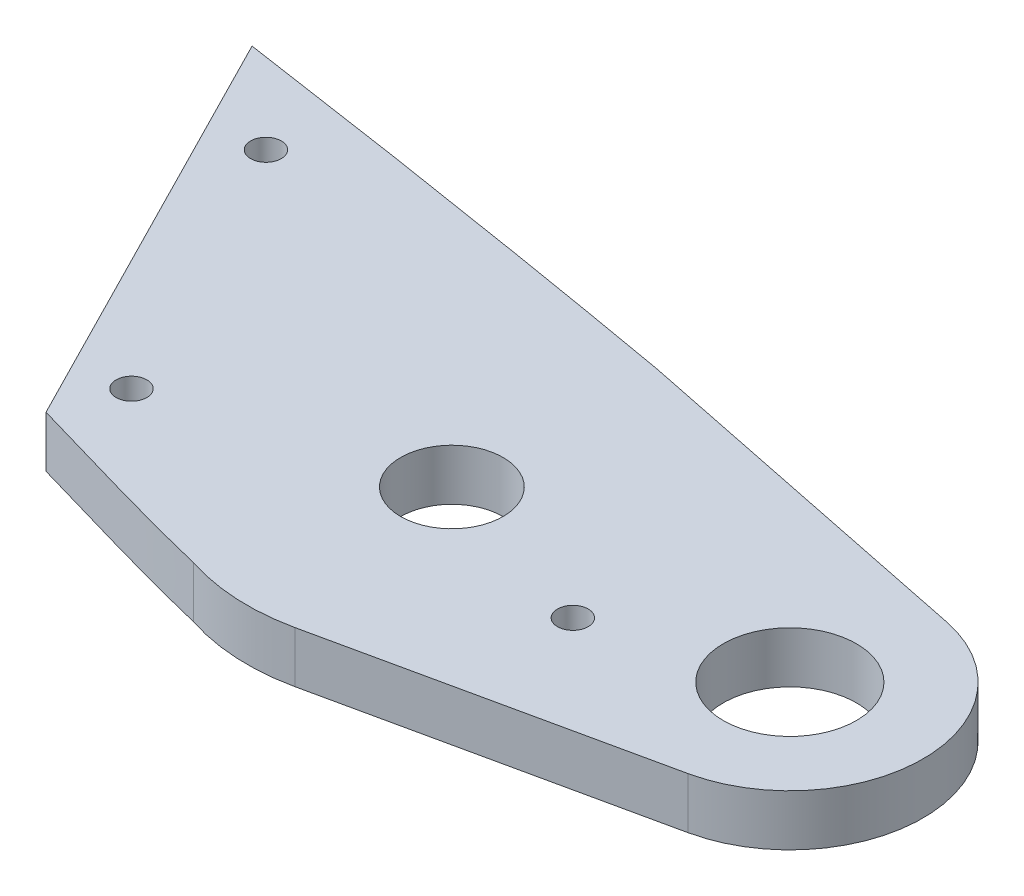
ISO-10303-21;
HEADER;
FILE_DESCRIPTION(('STEP AP214'),'2;1');
FILE_NAME('part.step','',(''),(''),'','','');
FILE_SCHEMA(('AUTOMOTIVE_DESIGN { 1 0 10303 214 1 1 1 1 }'));
ENDSEC;
DATA;
#1=APPLICATION_CONTEXT('core data for automotive mechanical design processes');
#2=APPLICATION_PROTOCOL_DEFINITION('international standard','automotive_design',2000,#1);
#3=PRODUCT_CONTEXT('',#1,'mechanical');
#4=PRODUCT('Part','Part','',(#3));
#5=PRODUCT_RELATED_PRODUCT_CATEGORY('part','',(#4));
#6=PRODUCT_DEFINITION_FORMATION('','',#4);
#7=PRODUCT_DEFINITION_CONTEXT('part definition',#1,'design');
#8=PRODUCT_DEFINITION('design','',#6,#7);
#9=PRODUCT_DEFINITION_SHAPE('','',#8);
#10=(LENGTH_UNIT() NAMED_UNIT(*) SI_UNIT(.MILLI.,.METRE.));
#11=(NAMED_UNIT(*) PLANE_ANGLE_UNIT() SI_UNIT($,.RADIAN.));
#12=(NAMED_UNIT(*) SI_UNIT($,.STERADIAN.) SOLID_ANGLE_UNIT());
#13=UNCERTAINTY_MEASURE_WITH_UNIT(LENGTH_MEASURE(1.E-05),#10,'distance_accuracy_value','');
#14=(GEOMETRIC_REPRESENTATION_CONTEXT(3) GLOBAL_UNCERTAINTY_ASSIGNED_CONTEXT((#13)) GLOBAL_UNIT_ASSIGNED_CONTEXT((#10,
#11,#12)) REPRESENTATION_CONTEXT('',''));
#15=CARTESIAN_POINT('',(0.,0.,0.));
#16=DIRECTION('',(0.,0.,1.));
#17=DIRECTION('',(1.,0.,0.));
#18=AXIS2_PLACEMENT_3D('',#15,#16,#17);
#19=CARTESIAN_POINT('',(4.24242424242424,-20.,19.5448672686026));
#20=DIRECTION('',(0.212121212121212,0.,0.977243363430127));
#21=DIRECTION('',(0.977243363430127,0.,-0.212121212121212));
#22=AXIS2_PLACEMENT_3D('',#19,#20,#21);
#23=PLANE('',#22);
#24=DIRECTION('',(0.,1.,0.));
#25=VECTOR('',#24,1.);
#26=CARTESIAN_POINT('',(35.7575757575758,-20.,12.7041637245917));
#27=LINE('',#26,#25);
#28=CARTESIAN_POINT('',(35.7575757575758,-20.,12.7041637245917));
#29=VERTEX_POINT('',#28);
#30=CARTESIAN_POINT('',(35.7575757575758,-15.,12.7041637245917));
#31=VERTEX_POINT('',#30);
#32=EDGE_CURVE('E314',#29,#31,#27,.T.);
#33=ORIENTED_EDGE('',*,*,#32,.T.);
#34=DIRECTION('',(-0.977243363430127,0.,0.212121212121212));
#35=VECTOR('',#34,1.);
#36=CARTESIAN_POINT('',(4.24242424242424,-15.,19.5448672686026));
#37=LINE('',#36,#35);
#38=CARTESIAN_POINT('',(4.24242424242424,-15.,19.5448672686026));
#39=VERTEX_POINT('',#38);
#40=EDGE_CURVE('E315',#31,#39,#37,.T.);
#41=ORIENTED_EDGE('',*,*,#40,.T.);
#42=DIRECTION('',(0.,1.,0.));
#43=VECTOR('',#42,1.);
#44=CARTESIAN_POINT('',(4.24242424242424,-20.,19.5448672686026));
#45=LINE('',#44,#43);
#46=CARTESIAN_POINT('',(4.24242424242424,-20.,19.5448672686026));
#47=VERTEX_POINT('',#46);
#48=EDGE_CURVE('E12',#47,#39,#45,.T.);
#49=ORIENTED_EDGE('',*,*,#48,.F.);
#50=DIRECTION('',(0.977243363430127,0.,-0.212121212121212));
#51=VECTOR('',#50,1.);
#52=CARTESIAN_POINT('',(4.24242424242424,-20.,19.5448672686026));
#53=LINE('',#52,#51);
#54=EDGE_CURVE('E316',#47,#29,#53,.T.);
#55=ORIENTED_EDGE('',*,*,#54,.T.);
#56=EDGE_LOOP('',(#33,#41,#49,#55));
#57=FACE_BOUND('',#56,.T.);
#58=ADVANCED_FACE('F183',(#57),#23,.T.);
#59=CARTESIAN_POINT('',(0.,-20.,0.));
#60=DIRECTION('',(0.,1.,0.));
#61=DIRECTION('',(0.,0.,1.));
#62=AXIS2_PLACEMENT_3D('',#59,#60,#61);
#63=CYLINDRICAL_SURFACE('',#62,20.);
#64=ORIENTED_EDGE('',*,*,#48,.T.);
#65=CARTESIAN_POINT('',(0.,-15.,0.));
#66=DIRECTION('',(0.,1.,0.));
#67=DIRECTION('',(0.,0.,1.));
#68=AXIS2_PLACEMENT_3D('',#65,#66,#67);
#69=CIRCLE('',#68,20.);
#70=CARTESIAN_POINT('',(-6.20287959444665,-15.,19.013791961016));
#71=VERTEX_POINT('',#70);
#72=EDGE_CURVE('E349',#39,#71,#69,.F.);
#73=ORIENTED_EDGE('',*,*,#72,.T.);
#74=DIRECTION('',(0.,1.,0.));
#75=VECTOR('',#74,1.);
#76=CARTESIAN_POINT('',(-6.20287959444665,-20.,19.013791961016));
#77=LINE('',#76,#75);
#78=CARTESIAN_POINT('',(-6.20287959444665,-20.,19.013791961016));
#79=VERTEX_POINT('',#78);
#80=EDGE_CURVE('E193',#79,#71,#77,.T.);
#81=ORIENTED_EDGE('',*,*,#80,.F.);
#82=CARTESIAN_POINT('',(0.,-20.,0.));
#83=DIRECTION('',(0.,1.,0.));
#84=DIRECTION('',(0.,0.,1.));
#85=AXIS2_PLACEMENT_3D('',#82,#83,#84);
#86=CIRCLE('',#85,20.);
#87=EDGE_CURVE('E264',#79,#47,#86,.T.);
#88=ORIENTED_EDGE('',*,*,#87,.T.);
#89=EDGE_LOOP('',(#64,#73,#81,#88));
#90=FACE_BOUND('',#89,.T.);
#91=ADVANCED_FACE('F288',(#90),#63,.T.);
#92=CARTESIAN_POINT('',(3.91711620015493,-20.,-19.2008804293113));
#93=DIRECTION('',(-0.199889916039891,0.,0.97981836146582));
#94=DIRECTION('',(0.97981836146582,0.,0.199889916039891));
#95=AXIS2_PLACEMENT_3D('',#92,#93,#94);
#96=PLANE('',#95);
#97=DIRECTION('',(-0.97981836146582,0.,-0.199889916039891));
#98=VECTOR('',#97,1.);
#99=CARTESIAN_POINT('',(3.91711620015493,-15.,-19.2008804293113));
#100=LINE('',#99,#98);
#101=CARTESIAN_POINT('',(35.5985689085186,-15.,-12.7376386990557));
#102=VERTEX_POINT('',#101);
#103=CARTESIAN_POINT('',(0.,-15.,-20.));
#104=VERTEX_POINT('',#103);
#105=EDGE_CURVE('E358',#102,#104,#100,.T.);
#106=ORIENTED_EDGE('',*,*,#105,.F.);
#107=DIRECTION('',(0.,1.,0.));
#108=VECTOR('',#107,1.);
#109=CARTESIAN_POINT('',(35.5985689085186,-20.,-12.7376386990557));
#110=LINE('',#109,#108);
#111=CARTESIAN_POINT('',(35.5985689085186,-20.,-12.7376386990557));
#112=VERTEX_POINT('',#111);
#113=EDGE_CURVE('E320',#112,#102,#110,.T.);
#114=ORIENTED_EDGE('',*,*,#113,.F.);
#115=DIRECTION('',(0.97981836146582,0.,0.199889916039891));
#116=VECTOR('',#115,1.);
#117=CARTESIAN_POINT('',(3.91711620015493,-20.,-19.2008804293113));
#118=LINE('',#117,#116);
#119=CARTESIAN_POINT('',(0.,-20.,-20.));
#120=VERTEX_POINT('',#119);
#121=EDGE_CURVE('E269',#120,#112,#118,.T.);
#122=ORIENTED_EDGE('',*,*,#121,.F.);
#123=DIRECTION('',(0.,1.,0.));
#124=VECTOR('',#123,1.);
#125=CARTESIAN_POINT('',(0.,-20.,-20.));
#126=LINE('',#125,#124);
#127=EDGE_CURVE('E323',#120,#104,#126,.T.);
#128=ORIENTED_EDGE('',*,*,#127,.T.);
#129=EDGE_LOOP('',(#106,#114,#122,#128));
#130=FACE_BOUND('',#129,.T.);
#131=ADVANCED_FACE('F293',(#130),#96,.F.);
#132=CARTESIAN_POINT('',(0.,-20.,0.));
#133=DIRECTION('',(0.,1.,0.));
#134=DIRECTION('',(0.,0.,1.));
#135=AXIS2_PLACEMENT_3D('',#132,#133,#134);
#136=CYLINDRICAL_SURFACE('',#135,5.);
#137=CARTESIAN_POINT('',(0.,-20.,0.));
#138=DIRECTION('',(0.,1.,0.));
#139=DIRECTION('',(0.,0.,1.));
#140=AXIS2_PLACEMENT_3D('',#137,#138,#139);
#141=CIRCLE('',#140,5.);
#142=CARTESIAN_POINT('',(0.,-20.,5.));
#143=VERTEX_POINT('',#142);
#144=EDGE_CURVE('E267',#143,#143,#141,.T.);
#145=ORIENTED_EDGE('',*,*,#144,.F.);
#146=EDGE_LOOP('',(#145));
#147=FACE_BOUND('',#146,.T.);
#148=CARTESIAN_POINT('',(0.,-15.,0.));
#149=DIRECTION('',(0.,1.,0.));
#150=DIRECTION('',(0.,0.,1.));
#151=AXIS2_PLACEMENT_3D('',#148,#149,#150);
#152=CIRCLE('',#151,5.);
#153=CARTESIAN_POINT('',(0.,-15.,5.));
#154=VERTEX_POINT('',#153);
#155=EDGE_CURVE('E348',#154,#154,#152,.F.);
#156=ORIENTED_EDGE('',*,*,#155,.F.);
#157=EDGE_LOOP('',(#156));
#158=FACE_BOUND('',#157,.T.);
#159=ADVANCED_FACE('F295',(#147,#158),#136,.F.);
#160=CARTESIAN_POINT('',(33.,-20.,0.));
#161=DIRECTION('',(0.,1.,0.));
#162=DIRECTION('',(0.,0.,1.));
#163=AXIS2_PLACEMENT_3D('',#160,#161,#162);
#164=CYLINDRICAL_SURFACE('',#163,13.);
#165=ORIENTED_EDGE('',*,*,#113,.T.);
#166=CARTESIAN_POINT('',(33.,-15.,0.));
#167=DIRECTION('',(0.,1.,0.));
#168=DIRECTION('',(0.,0.,1.));
#169=AXIS2_PLACEMENT_3D('',#166,#167,#168);
#170=CIRCLE('',#169,13.);
#171=EDGE_CURVE('E332',#102,#31,#170,.F.);
#172=ORIENTED_EDGE('',*,*,#171,.T.);
#173=ORIENTED_EDGE('',*,*,#32,.F.);
#174=CARTESIAN_POINT('',(33.,-20.,0.));
#175=DIRECTION('',(0.,1.,0.));
#176=DIRECTION('',(0.,0.,1.));
#177=AXIS2_PLACEMENT_3D('',#174,#175,#176);
#178=CIRCLE('',#177,13.);
#179=EDGE_CURVE('E372',#29,#112,#178,.T.);
#180=ORIENTED_EDGE('',*,*,#179,.T.);
#181=EDGE_LOOP('',(#165,#172,#173,#180));
#182=FACE_BOUND('',#181,.T.);
#183=ADVANCED_FACE('F297',(#182),#164,.T.);
#184=CARTESIAN_POINT('',(33.,-20.,0.));
#185=DIRECTION('',(0.,1.,0.));
#186=DIRECTION('',(0.,0.,1.));
#187=AXIS2_PLACEMENT_3D('',#184,#185,#186);
#188=CYLINDRICAL_SURFACE('',#187,6.5);
#189=CARTESIAN_POINT('',(33.,-20.,0.));
#190=DIRECTION('',(0.,1.,0.));
#191=DIRECTION('',(0.,0.,1.));
#192=AXIS2_PLACEMENT_3D('',#189,#190,#191);
#193=CIRCLE('',#192,6.5);
#194=CARTESIAN_POINT('',(33.,-20.,6.5));
#195=VERTEX_POINT('',#194);
#196=EDGE_CURVE('E321',#195,#195,#193,.T.);
#197=ORIENTED_EDGE('',*,*,#196,.F.);
#198=EDGE_LOOP('',(#197));
#199=FACE_BOUND('',#198,.T.);
#200=CARTESIAN_POINT('',(33.,-15.,0.));
#201=DIRECTION('',(0.,1.,0.));
#202=DIRECTION('',(0.,0.,1.));
#203=AXIS2_PLACEMENT_3D('',#200,#201,#202);
#204=CIRCLE('',#203,6.5);
#205=CARTESIAN_POINT('',(33.,-15.,6.5));
#206=VERTEX_POINT('',#205);
#207=EDGE_CURVE('E329',#206,#206,#204,.F.);
#208=ORIENTED_EDGE('',*,*,#207,.F.);
#209=EDGE_LOOP('',(#208));
#210=FACE_BOUND('',#209,.T.);
#211=ADVANCED_FACE('F287',(#199,#210),#188,.F.);
#212=CARTESIAN_POINT('',(-271.715728752538,-20.,28.2842712474621));
#213=CARTESIAN_POINT('',(-189.219937614107,-20.,-54.211519890968));
#214=CARTESIAN_POINT('',(-19.999999999985,-20.,20.0000000000001));
#215=CARTESIAN_POINT('',(0.,-20.,20.));
#216=B_SPLINE_CURVE_WITH_KNOTS('',3,(#212,#213,#214,#215),.UNSPECIFIED.,.F.,.F.,(4,4),(0.,1.),.UNSPECIFIED.);
#217=DIRECTION('',(0.,1.,0.));
#218=VECTOR('',#217,1.);
#219=SURFACE_OF_LINEAR_EXTRUSION('',#216,#218);
#220=DIRECTION('',(0.,1.,0.));
#221=VECTOR('',#220,1.);
#222=CARTESIAN_POINT('',(-26.1376583175019,-30.,13.489817143929));
#223=LINE('',#222,#221);
#224=CARTESIAN_POINT('',(-26.1376583175019,-20.,13.489817143929));
#225=VERTEX_POINT('',#224);
#226=CARTESIAN_POINT('',(-26.1376583175026,-15.,13.4898171439276));
#227=VERTEX_POINT('',#226);
#228=EDGE_CURVE('E248',#225,#227,#223,.T.);
#229=ORIENTED_EDGE('',*,*,#228,.F.);
#230=EDGE_CURVE('E207',#225,#79,#216,.T.);
#231=ORIENTED_EDGE('',*,*,#230,.T.);
#232=ORIENTED_EDGE('',*,*,#80,.T.);
#233=CARTESIAN_POINT('',(-271.715728752538,-15.,28.2842712474621));
#234=CARTESIAN_POINT('',(-189.219937614107,-15.,-54.211519890968));
#235=CARTESIAN_POINT('',(-19.999999999985,-15.,20.0000000000001));
#236=CARTESIAN_POINT('',(0.,-15.,20.));
#237=B_SPLINE_CURVE_WITH_KNOTS('',3,(#233,#234,#235,#236),.UNSPECIFIED.,.F.,.F.,(4,4),(0.,1.),.UNSPECIFIED.);
#238=EDGE_CURVE('E258',#71,#227,#237,.F.);
#239=ORIENTED_EDGE('',*,*,#238,.T.);
#240=EDGE_LOOP('',(#229,#231,#232,#239));
#241=FACE_BOUND('',#240,.T.);
#242=ADVANCED_FACE('F257',(#241),#219,.T.);
#243=CARTESIAN_POINT('',(-328.284271247462,-20.,-28.284271247462));
#244=CARTESIAN_POINT('',(-300.,-20.,-56.5685424949237));
#245=CARTESIAN_POINT('',(-114.87313182139,-20.,-40.3782898364082));
#246=CARTESIAN_POINT('',(3.06083510061379E-13,-20.,-19.9999999999999));
#247=B_SPLINE_CURVE_WITH_KNOTS('',3,(#243,#244,#245,#246),.UNSPECIFIED.,.F.,.F.,(4,4),(0.,1.),.UNSPECIFIED.);
#248=DIRECTION('',(0.,1.,0.));
#249=VECTOR('',#248,1.);
#250=SURFACE_OF_LINEAR_EXTRUSION('',#247,#249);
#251=CARTESIAN_POINT('',(-47.0370499959522,-20.,-27.5275485228644));
#252=VERTEX_POINT('',#251);
#253=EDGE_CURVE('E265',#252,#120,#247,.T.);
#254=ORIENTED_EDGE('',*,*,#253,.F.);
#255=DIRECTION('',(0.,1.,0.));
#256=VECTOR('',#255,1.);
#257=CARTESIAN_POINT('',(-47.0370499959522,-30.,-27.5275485228644));
#258=LINE('',#257,#256);
#259=CARTESIAN_POINT('',(-47.0370499959522,-15.,-27.5275485228644));
#260=VERTEX_POINT('',#259);
#261=EDGE_CURVE('E251',#252,#260,#258,.T.);
#262=ORIENTED_EDGE('',*,*,#261,.T.);
#263=CARTESIAN_POINT('',(-328.284271247462,-15.,-28.284271247462));
#264=CARTESIAN_POINT('',(-300.,-15.,-56.5685424949237));
#265=CARTESIAN_POINT('',(-114.87313182139,-15.,-40.3782898364082));
#266=CARTESIAN_POINT('',(3.06083510061379E-13,-15.,-19.9999999999999));
#267=B_SPLINE_CURVE_WITH_KNOTS('',3,(#263,#264,#265,#266),.UNSPECIFIED.,.F.,.F.,(4,4),(0.,1.),.UNSPECIFIED.);
#268=EDGE_CURVE('E353',#104,#260,#267,.F.);
#269=ORIENTED_EDGE('',*,*,#268,.F.);
#270=ORIENTED_EDGE('',*,*,#127,.F.);
#271=EDGE_LOOP('',(#254,#262,#269,#270));
#272=FACE_BOUND('',#271,.T.);
#273=ADVANCED_FACE('F286',(#272),#250,.F.);
#274=CARTESIAN_POINT('',(0.,-20.,0.));
#275=DIRECTION('',(0.,1.,0.));
#276=DIRECTION('',(0.,0.,1.));
#277=AXIS2_PLACEMENT_3D('',#274,#275,#276);
#278=PLANE('',#277);
#279=CARTESIAN_POINT('',(-37.5886921442137,-20.,-19.4367073700558));
#280=DIRECTION('',(0.,-1.,0.));
#281=DIRECTION('',(0.,0.,-1.));
#282=AXIS2_PLACEMENT_3D('',#279,#280,#281);
#283=CIRCLE('',#282,1.50000000000111);
#284=CARTESIAN_POINT('',(-37.5886921442137,-20.,-20.9367073700569));
#285=VERTEX_POINT('',#284);
#286=EDGE_CURVE('E254',#285,#285,#283,.T.);
#287=ORIENTED_EDGE('',*,*,#286,.F.);
#288=EDGE_LOOP('',(#287));
#289=FACE_BOUND('',#288,.T.);
#290=CARTESIAN_POINT('',(16.9711800873128,-20.,5.15904299319243));
#291=DIRECTION('',(0.,-1.,0.));
#292=DIRECTION('',(0.,0.,-1.));
#293=AXIS2_PLACEMENT_3D('',#290,#291,#292);
#294=CIRCLE('',#293,1.5);
#295=CARTESIAN_POINT('',(16.9711800873128,-20.,3.65904299319243));
#296=VERTEX_POINT('',#295);
#297=EDGE_CURVE('E513',#296,#296,#294,.T.);
#298=ORIENTED_EDGE('',*,*,#297,.F.);
#299=EDGE_LOOP('',(#298));
#300=FACE_BOUND('',#299,.T.);
#301=CARTESIAN_POINT('',(-23.9507725885606,-20.,7.32921682310345));
#302=DIRECTION('',(0.,-1.,0.));
#303=DIRECTION('',(0.,0.,-1.));
#304=AXIS2_PLACEMENT_3D('',#301,#302,#303);
#305=CIRCLE('',#304,1.50000000000111);
#306=CARTESIAN_POINT('',(-23.9507725885606,-20.,5.82921682310234));
#307=VERTEX_POINT('',#306);
#308=EDGE_CURVE('E338',#307,#307,#305,.T.);
#309=ORIENTED_EDGE('',*,*,#308,.F.);
#310=EDGE_LOOP('',(#309));
#311=FACE_BOUND('',#310,.T.);
#312=ORIENTED_EDGE('',*,*,#230,.F.);
#313=DIRECTION('',(-0.453990499739548,0.,-0.891006524188367));
#314=VECTOR('',#313,1.);
#315=CARTESIAN_POINT('',(-26.2072398632191,-20.,13.3532556713151));
#316=LINE('',#315,#314);
#317=EDGE_CURVE('E246',#225,#252,#316,.T.);
#318=ORIENTED_EDGE('',*,*,#317,.T.);
#319=ORIENTED_EDGE('',*,*,#253,.T.);
#320=ORIENTED_EDGE('',*,*,#121,.T.);
#321=ORIENTED_EDGE('',*,*,#179,.F.);
#322=ORIENTED_EDGE('',*,*,#54,.F.);
#323=ORIENTED_EDGE('',*,*,#87,.F.);
#324=EDGE_LOOP('',(#312,#318,#319,#320,#321,#322,#323));
#325=FACE_BOUND('',#324,.T.);
#326=ORIENTED_EDGE('',*,*,#196,.T.);
#327=EDGE_LOOP('',(#326));
#328=FACE_BOUND('',#327,.T.);
#329=ORIENTED_EDGE('',*,*,#144,.T.);
#330=EDGE_LOOP('',(#329));
#331=FACE_BOUND('',#330,.T.);
#332=ADVANCED_FACE('F261',(#289,#300,#311,#325,#328,#331),#278,.F.);
#333=CARTESIAN_POINT('',(0.,-15.,0.));
#334=DIRECTION('',(0.,1.,0.));
#335=DIRECTION('',(0.,0.,1.));
#336=AXIS2_PLACEMENT_3D('',#333,#334,#335);
#337=PLANE('',#336);
#338=CARTESIAN_POINT('',(-37.5886921442137,-15.,-19.4367073700558));
#339=DIRECTION('',(0.,1.,0.));
#340=DIRECTION('',(0.,0.,1.));
#341=AXIS2_PLACEMENT_3D('',#338,#339,#340);
#342=CIRCLE('',#341,1.50000000000111);
#343=CARTESIAN_POINT('',(-37.5886921442137,-15.,-17.9367073700546));
#344=VERTEX_POINT('',#343);
#345=EDGE_CURVE('E341',#344,#344,#342,.T.);
#346=ORIENTED_EDGE('',*,*,#345,.F.);
#347=EDGE_LOOP('',(#346));
#348=FACE_BOUND('',#347,.T.);
#349=CARTESIAN_POINT('',(16.9711800873128,-15.,5.15904299319243));
#350=DIRECTION('',(0.,1.,0.));
#351=DIRECTION('',(0.,0.,1.));
#352=AXIS2_PLACEMENT_3D('',#349,#350,#351);
#353=CIRCLE('',#352,1.5);
#354=CARTESIAN_POINT('',(16.9711800873128,-15.,6.65904299319243));
#355=VERTEX_POINT('',#354);
#356=EDGE_CURVE('E337',#355,#355,#353,.T.);
#357=ORIENTED_EDGE('',*,*,#356,.F.);
#358=EDGE_LOOP('',(#357));
#359=FACE_BOUND('',#358,.T.);
#360=CARTESIAN_POINT('',(-23.9507725885606,-15.,7.32921682310345));
#361=DIRECTION('',(0.,1.,0.));
#362=DIRECTION('',(0.,0.,1.));
#363=AXIS2_PLACEMENT_3D('',#360,#361,#362);
#364=CIRCLE('',#363,1.50000000000111);
#365=CARTESIAN_POINT('',(-23.9507725885606,-15.,8.82921682310456));
#366=VERTEX_POINT('',#365);
#367=EDGE_CURVE('E334',#366,#366,#364,.T.);
#368=ORIENTED_EDGE('',*,*,#367,.F.);
#369=EDGE_LOOP('',(#368));
#370=FACE_BOUND('',#369,.T.);
#371=ORIENTED_EDGE('',*,*,#72,.F.);
#372=ORIENTED_EDGE('',*,*,#40,.F.);
#373=ORIENTED_EDGE('',*,*,#171,.F.);
#374=ORIENTED_EDGE('',*,*,#105,.T.);
#375=ORIENTED_EDGE('',*,*,#268,.T.);
#376=DIRECTION('',(0.453990499739548,0.,0.891006524188367));
#377=VECTOR('',#376,1.);
#378=CARTESIAN_POINT('',(-17.2627680221852,-15.,30.9077700727233));
#379=LINE('',#378,#377);
#380=EDGE_CURVE('E333',#260,#227,#379,.T.);
#381=ORIENTED_EDGE('',*,*,#380,.T.);
#382=ORIENTED_EDGE('',*,*,#238,.F.);
#383=EDGE_LOOP('',(#371,#372,#373,#374,#375,#381,#382));
#384=FACE_BOUND('',#383,.T.);
#385=ORIENTED_EDGE('',*,*,#207,.T.);
#386=EDGE_LOOP('',(#385));
#387=FACE_BOUND('',#386,.T.);
#388=ORIENTED_EDGE('',*,*,#155,.T.);
#389=EDGE_LOOP('',(#388));
#390=FACE_BOUND('',#389,.T.);
#391=ADVANCED_FACE('F377',(#348,#359,#370,#384,#387,#390),#337,.T.);
#392=CARTESIAN_POINT('',(-23.9507725885606,-10.,7.32921682310345));
#393=DIRECTION('',(0.,-1.,0.));
#394=DIRECTION('',(0.,0.,-1.));
#395=AXIS2_PLACEMENT_3D('',#392,#393,#394);
#396=CYLINDRICAL_SURFACE('',#395,1.50000000000111);
#397=ORIENTED_EDGE('',*,*,#367,.T.);
#398=EDGE_LOOP('',(#397));
#399=FACE_BOUND('',#398,.T.);
#400=ORIENTED_EDGE('',*,*,#308,.T.);
#401=EDGE_LOOP('',(#400));
#402=FACE_BOUND('',#401,.T.);
#403=ADVANCED_FACE('F387',(#399,#402),#396,.F.);
#404=CARTESIAN_POINT('',(16.9711800873128,-10.,5.15904299319243));
#405=DIRECTION('',(0.,-1.,0.));
#406=DIRECTION('',(0.,0.,-1.));
#407=AXIS2_PLACEMENT_3D('',#404,#405,#406);
#408=CYLINDRICAL_SURFACE('',#407,1.5);
#409=ORIENTED_EDGE('',*,*,#356,.T.);
#410=EDGE_LOOP('',(#409));
#411=FACE_BOUND('',#410,.T.);
#412=ORIENTED_EDGE('',*,*,#297,.T.);
#413=EDGE_LOOP('',(#412));
#414=FACE_BOUND('',#413,.T.);
#415=ADVANCED_FACE('F394',(#411,#414),#408,.F.);
#416=CARTESIAN_POINT('',(-37.5886921442137,-10.,-19.4367073700558));
#417=DIRECTION('',(0.,-1.,0.));
#418=DIRECTION('',(0.,0.,-1.));
#419=AXIS2_PLACEMENT_3D('',#416,#417,#418);
#420=CYLINDRICAL_SURFACE('',#419,1.50000000000111);
#421=ORIENTED_EDGE('',*,*,#345,.T.);
#422=EDGE_LOOP('',(#421));
#423=FACE_BOUND('',#422,.T.);
#424=ORIENTED_EDGE('',*,*,#286,.T.);
#425=EDGE_LOOP('',(#424));
#426=FACE_BOUND('',#425,.T.);
#427=ADVANCED_FACE('F402',(#423,#426),#420,.F.);
#428=CARTESIAN_POINT('',(-47.0370499959522,-30.,-27.5275485228644));
#429=DIRECTION('',(0.891006524188367,0.,-0.453990499739548));
#430=DIRECTION('',(-0.453990499739548,0.,-0.891006524188367));
#431=AXIS2_PLACEMENT_3D('',#428,#429,#430);
#432=PLANE('',#431);
#433=ORIENTED_EDGE('',*,*,#228,.T.);
#434=ORIENTED_EDGE('',*,*,#380,.F.);
#435=ORIENTED_EDGE('',*,*,#261,.F.);
#436=ORIENTED_EDGE('',*,*,#317,.F.);
#437=EDGE_LOOP('',(#433,#434,#435,#436));
#438=FACE_BOUND('',#437,.T.);
#439=ADVANCED_FACE('F247',(#438),#432,.F.);
#440=CLOSED_SHELL('',(#58,#91,#131,#159,#183,#211,#242,#273,#332,#391,#403,#415,#427,#439));
#441=MANIFOLD_SOLID_BREP('B2',#440);
#442=ADVANCED_BREP_SHAPE_REPRESENTATION('',(#18,#441),#14);
#443=SHAPE_DEFINITION_REPRESENTATION(#9,#442);
ENDSEC;
END-ISO-10303-21;
